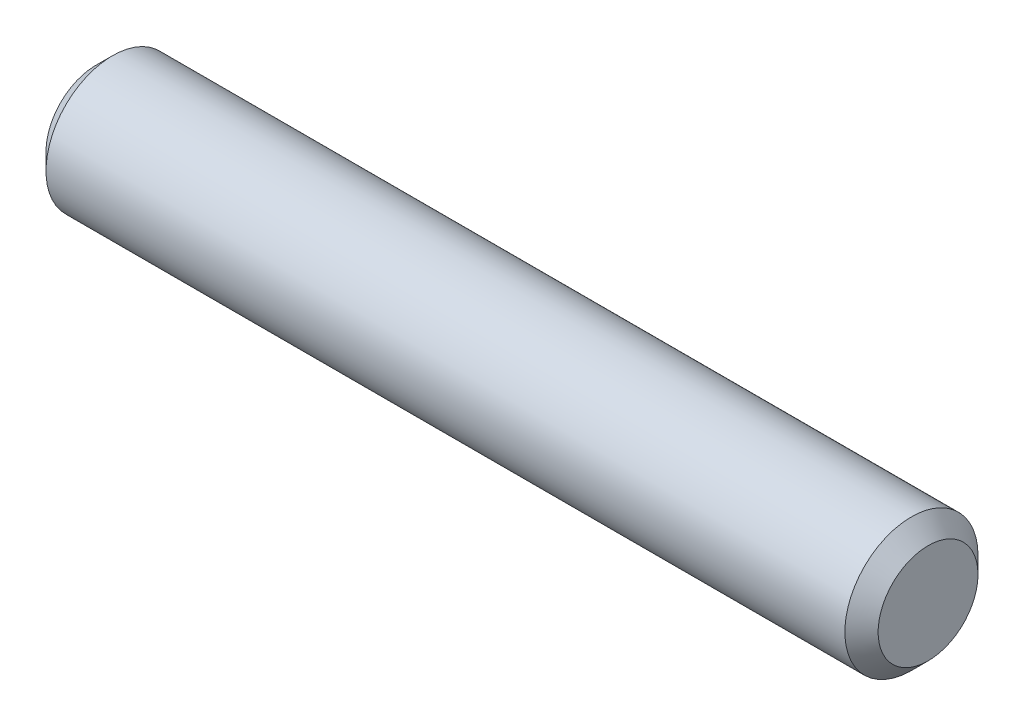
ISO-10303-21;
HEADER;
FILE_DESCRIPTION(('STEP AP214'),'2;1');
FILE_NAME('part.step','',(''),(''),'','','');
FILE_SCHEMA(('AUTOMOTIVE_DESIGN { 1 0 10303 214 1 1 1 1 }'));
ENDSEC;
DATA;
#1=APPLICATION_CONTEXT('core data for automotive mechanical design processes');
#2=APPLICATION_PROTOCOL_DEFINITION('international standard','automotive_design',2000,#1);
#3=PRODUCT_CONTEXT('',#1,'mechanical');
#4=PRODUCT('Part','Part','',(#3));
#5=PRODUCT_RELATED_PRODUCT_CATEGORY('part','',(#4));
#6=PRODUCT_DEFINITION_FORMATION('','',#4);
#7=PRODUCT_DEFINITION_CONTEXT('part definition',#1,'design');
#8=PRODUCT_DEFINITION('design','',#6,#7);
#9=PRODUCT_DEFINITION_SHAPE('','',#8);
#10=(LENGTH_UNIT() NAMED_UNIT(*) SI_UNIT(.MILLI.,.METRE.));
#11=(NAMED_UNIT(*) PLANE_ANGLE_UNIT() SI_UNIT($,.RADIAN.));
#12=(NAMED_UNIT(*) SI_UNIT($,.STERADIAN.) SOLID_ANGLE_UNIT());
#13=UNCERTAINTY_MEASURE_WITH_UNIT(LENGTH_MEASURE(1.E-05),#10,'distance_accuracy_value','');
#14=(GEOMETRIC_REPRESENTATION_CONTEXT(3) GLOBAL_UNCERTAINTY_ASSIGNED_CONTEXT((#13)) GLOBAL_UNIT_ASSIGNED_CONTEXT((#10,
#11,#12)) REPRESENTATION_CONTEXT('',''));
#15=CARTESIAN_POINT('',(0.,0.,0.));
#16=DIRECTION('',(0.,0.,1.));
#17=DIRECTION('',(1.,0.,0.));
#18=AXIS2_PLACEMENT_3D('',#15,#16,#17);
#19=CARTESIAN_POINT('',(50.,0.,0.));
#20=DIRECTION('',(-1.,0.,0.));
#21=DIRECTION('',(0.,0.,1.));
#22=AXIS2_PLACEMENT_3D('',#19,#20,#21);
#23=CYLINDRICAL_SURFACE('',#22,4.);
#24=CARTESIAN_POINT('',(1.,0.,0.));
#25=DIRECTION('',(1.,0.,0.));
#26=DIRECTION('',(0.,0.,-1.));
#27=AXIS2_PLACEMENT_3D('',#24,#25,#26);
#28=CIRCLE('',#27,4.);
#29=CARTESIAN_POINT('',(1.,0.,-4.));
#30=VERTEX_POINT('',#29);
#31=EDGE_CURVE('E53',#30,#30,#28,.T.);
#32=ORIENTED_EDGE('',*,*,#31,.T.);
#33=EDGE_LOOP('',(#32));
#34=FACE_BOUND('',#33,.T.);
#35=CARTESIAN_POINT('',(49.,0.,0.));
#36=DIRECTION('',(1.,0.,0.));
#37=DIRECTION('',(0.,0.,-1.));
#38=AXIS2_PLACEMENT_3D('',#35,#36,#37);
#39=CIRCLE('',#38,4.);
#40=CARTESIAN_POINT('',(49.,0.,-4.));
#41=VERTEX_POINT('',#40);
#42=EDGE_CURVE('E58',#41,#41,#39,.F.);
#43=ORIENTED_EDGE('',*,*,#42,.T.);
#44=EDGE_LOOP('',(#43));
#45=FACE_BOUND('',#44,.T.);
#46=ADVANCED_FACE('F39',(#34,#45),#23,.T.);
#47=CARTESIAN_POINT('',(50.,0.,0.));
#48=DIRECTION('',(1.,0.,0.));
#49=DIRECTION('',(0.,0.,-1.));
#50=AXIS2_PLACEMENT_3D('',#47,#48,#49);
#51=PLANE('',#50);
#52=CARTESIAN_POINT('',(50.,0.,0.));
#53=DIRECTION('',(1.,0.,0.));
#54=DIRECTION('',(0.,0.,-1.));
#55=AXIS2_PLACEMENT_3D('',#52,#53,#54);
#56=CIRCLE('',#55,2.99999999999999);
#57=CARTESIAN_POINT('',(50.,0.,-2.99999999999999));
#58=VERTEX_POINT('',#57);
#59=EDGE_CURVE('E10',#58,#58,#56,.T.);
#60=ORIENTED_EDGE('',*,*,#59,.T.);
#61=EDGE_LOOP('',(#60));
#62=FACE_BOUND('',#61,.T.);
#63=ADVANCED_FACE('F75',(#62),#51,.T.);
#64=CARTESIAN_POINT('',(0.,0.,0.));
#65=DIRECTION('',(1.,0.,0.));
#66=DIRECTION('',(0.,0.,-1.));
#67=AXIS2_PLACEMENT_3D('',#64,#65,#66);
#68=PLANE('',#67);
#69=CARTESIAN_POINT('',(0.,0.,0.));
#70=DIRECTION('',(1.,0.,0.));
#71=DIRECTION('',(0.,0.,-1.));
#72=AXIS2_PLACEMENT_3D('',#69,#70,#71);
#73=CIRCLE('',#72,2.99999999999999);
#74=CARTESIAN_POINT('',(0.,0.,-2.99999999999999));
#75=VERTEX_POINT('',#74);
#76=EDGE_CURVE('E48',#75,#75,#73,.F.);
#77=ORIENTED_EDGE('',*,*,#76,.T.);
#78=EDGE_LOOP('',(#77));
#79=FACE_BOUND('',#78,.T.);
#80=ADVANCED_FACE('F72',(#79),#68,.F.);
#81=CARTESIAN_POINT('',(1.,0.,0.));
#82=DIRECTION('',(1.,0.,0.));
#83=DIRECTION('',(0.,0.,-1.));
#84=AXIS2_PLACEMENT_3D('',#81,#82,#83);
#85=CONICAL_SURFACE('',#84,4.,0.785398163397454);
#86=ORIENTED_EDGE('',*,*,#76,.F.);
#87=EDGE_LOOP('',(#86));
#88=FACE_BOUND('',#87,.T.);
#89=ORIENTED_EDGE('',*,*,#31,.F.);
#90=EDGE_LOOP('',(#89));
#91=FACE_BOUND('',#90,.T.);
#92=ADVANCED_FACE('F68',(#88,#91),#85,.T.);
#93=CARTESIAN_POINT('',(50.,0.,0.));
#94=DIRECTION('',(-1.,0.,0.));
#95=DIRECTION('',(0.,0.,1.));
#96=AXIS2_PLACEMENT_3D('',#93,#94,#95);
#97=CONICAL_SURFACE('',#96,2.99999999999999,0.785398163397447);
#98=ORIENTED_EDGE('',*,*,#42,.F.);
#99=EDGE_LOOP('',(#98));
#100=FACE_BOUND('',#99,.T.);
#101=ORIENTED_EDGE('',*,*,#59,.F.);
#102=EDGE_LOOP('',(#101));
#103=FACE_BOUND('',#102,.T.);
#104=ADVANCED_FACE('F42',(#100,#103),#97,.T.);
#105=CLOSED_SHELL('',(#46,#63,#80,#92,#104));
#106=MANIFOLD_SOLID_BREP('B2',#105);
#107=ADVANCED_BREP_SHAPE_REPRESENTATION('',(#18,#106),#14);
#108=SHAPE_DEFINITION_REPRESENTATION(#9,#107);
ENDSEC;
END-ISO-10303-21;
